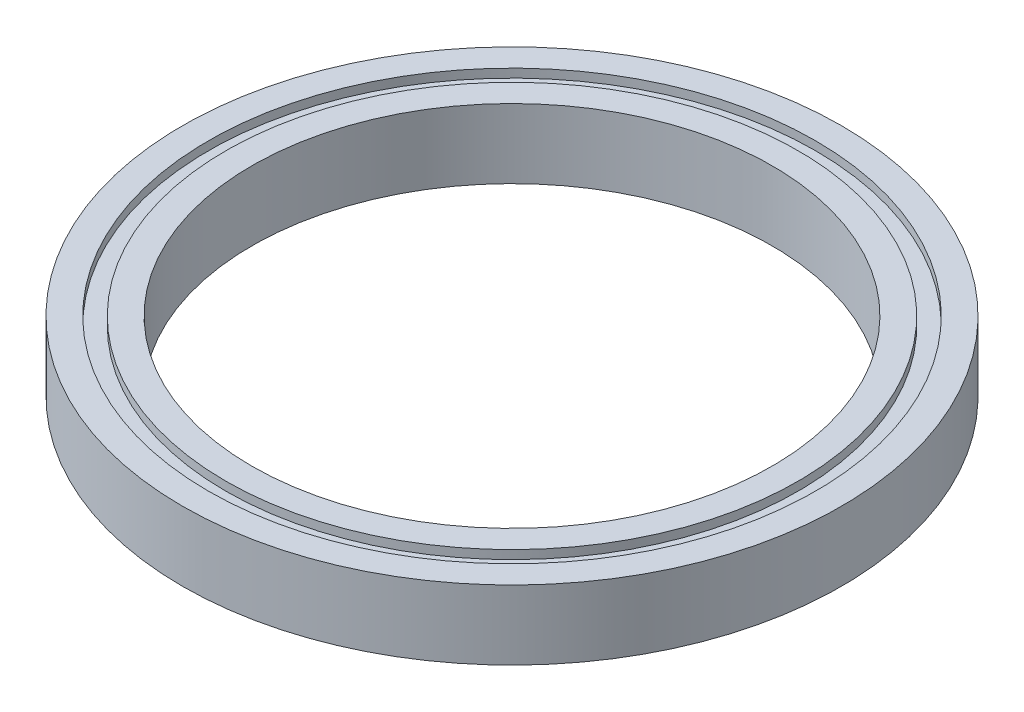
ISO-10303-21;
HEADER;
FILE_DESCRIPTION(('STEP AP214'),'2;1');
FILE_NAME('part.step','',(''),(''),'','','');
FILE_SCHEMA(('AUTOMOTIVE_DESIGN { 1 0 10303 214 1 1 1 1 }'));
ENDSEC;
DATA;
#1=APPLICATION_CONTEXT('core data for automotive mechanical design processes');
#2=APPLICATION_PROTOCOL_DEFINITION('international standard','automotive_design',2000,#1);
#3=PRODUCT_CONTEXT('',#1,'mechanical');
#4=PRODUCT('Part','Part','',(#3));
#5=PRODUCT_RELATED_PRODUCT_CATEGORY('part','',(#4));
#6=PRODUCT_DEFINITION_FORMATION('','',#4);
#7=PRODUCT_DEFINITION_CONTEXT('part definition',#1,'design');
#8=PRODUCT_DEFINITION('design','',#6,#7);
#9=PRODUCT_DEFINITION_SHAPE('','',#8);
#10=(LENGTH_UNIT() NAMED_UNIT(*) SI_UNIT(.MILLI.,.METRE.));
#11=(NAMED_UNIT(*) PLANE_ANGLE_UNIT() SI_UNIT($,.RADIAN.));
#12=(NAMED_UNIT(*) SI_UNIT($,.STERADIAN.) SOLID_ANGLE_UNIT());
#13=UNCERTAINTY_MEASURE_WITH_UNIT(LENGTH_MEASURE(1.E-05),#10,'distance_accuracy_value','');
#14=(GEOMETRIC_REPRESENTATION_CONTEXT(3) GLOBAL_UNCERTAINTY_ASSIGNED_CONTEXT((#13)) GLOBAL_UNIT_ASSIGNED_CONTEXT((#10,
#11,#12)) REPRESENTATION_CONTEXT('',''));
#15=CARTESIAN_POINT('',(0.,0.,0.));
#16=DIRECTION('',(0.,0.,1.));
#17=DIRECTION('',(1.,0.,0.));
#18=AXIS2_PLACEMENT_3D('',#15,#16,#17);
#19=CARTESIAN_POINT('',(0.,0.,0.));
#20=DIRECTION('',(0.,1.,0.));
#21=DIRECTION('',(0.,0.,1.));
#22=AXIS2_PLACEMENT_3D('',#19,#20,#21);
#23=PLANE('',#22);
#24=CARTESIAN_POINT('',(0.,0.,0.));
#25=DIRECTION('',(0.,1.,0.));
#26=DIRECTION('',(0.,0.,1.));
#27=AXIS2_PLACEMENT_3D('',#24,#25,#26);
#28=CIRCLE('',#27,30.);
#29=CARTESIAN_POINT('',(0.,0.,30.));
#30=VERTEX_POINT('',#29);
#31=EDGE_CURVE('E45',#30,#30,#28,.T.);
#32=ORIENTED_EDGE('',*,*,#31,.T.);
#33=EDGE_LOOP('',(#32));
#34=FACE_BOUND('',#33,.T.);
#35=CARTESIAN_POINT('',(0.,0.,0.));
#36=DIRECTION('',(0.,-1.,0.));
#37=DIRECTION('',(0.,0.,-1.));
#38=AXIS2_PLACEMENT_3D('',#35,#36,#37);
#39=CIRCLE('',#38,33.);
#40=CARTESIAN_POINT('',(0.,0.,-33.));
#41=VERTEX_POINT('',#40);
#42=EDGE_CURVE('E69',#41,#41,#39,.T.);
#43=ORIENTED_EDGE('',*,*,#42,.T.);
#44=EDGE_LOOP('',(#43));
#45=FACE_BOUND('',#44,.T.);
#46=ADVANCED_FACE('F32',(#34,#45),#23,.F.);
#47=CARTESIAN_POINT('',(0.,8.,0.));
#48=DIRECTION('',(0.,1.,0.));
#49=DIRECTION('',(0.,0.,1.));
#50=AXIS2_PLACEMENT_3D('',#47,#48,#49);
#51=PLANE('',#50);
#52=CARTESIAN_POINT('',(0.,8.,0.));
#53=DIRECTION('',(0.,1.,0.));
#54=DIRECTION('',(0.,0.,1.));
#55=AXIS2_PLACEMENT_3D('',#52,#53,#54);
#56=CIRCLE('',#55,30.);
#57=CARTESIAN_POINT('',(0.,8.,30.));
#58=VERTEX_POINT('',#57);
#59=EDGE_CURVE('E43',#58,#58,#56,.T.);
#60=ORIENTED_EDGE('',*,*,#59,.F.);
#61=EDGE_LOOP('',(#60));
#62=FACE_BOUND('',#61,.T.);
#63=CARTESIAN_POINT('',(0.,8.,0.));
#64=DIRECTION('',(0.,1.,0.));
#65=DIRECTION('',(0.,0.,1.));
#66=AXIS2_PLACEMENT_3D('',#63,#64,#65);
#67=CIRCLE('',#66,33.);
#68=CARTESIAN_POINT('',(0.,8.,33.));
#69=VERTEX_POINT('',#68);
#70=EDGE_CURVE('E57',#69,#69,#67,.T.);
#71=ORIENTED_EDGE('',*,*,#70,.T.);
#72=EDGE_LOOP('',(#71));
#73=FACE_BOUND('',#72,.T.);
#74=ADVANCED_FACE('F107',(#62,#73),#51,.T.);
#75=CARTESIAN_POINT('',(0.,8.,0.));
#76=DIRECTION('',(0.,1.,0.));
#77=DIRECTION('',(0.,0.,1.));
#78=AXIS2_PLACEMENT_3D('',#75,#76,#77);
#79=CIRCLE('',#78,35.);
#80=CARTESIAN_POINT('',(0.,8.,35.));
#81=VERTEX_POINT('',#80);
#82=EDGE_CURVE('E51',#81,#81,#79,.T.);
#83=ORIENTED_EDGE('',*,*,#82,.F.);
#84=EDGE_LOOP('',(#83));
#85=FACE_BOUND('',#84,.T.);
#86=CARTESIAN_POINT('',(0.,8.,0.));
#87=DIRECTION('',(0.,1.,0.));
#88=DIRECTION('',(0.,0.,1.));
#89=AXIS2_PLACEMENT_3D('',#86,#87,#88);
#90=CIRCLE('',#89,38.);
#91=CARTESIAN_POINT('',(0.,8.,38.));
#92=VERTEX_POINT('',#91);
#93=EDGE_CURVE('E10',#92,#92,#90,.T.);
#94=ORIENTED_EDGE('',*,*,#93,.T.);
#95=EDGE_LOOP('',(#94));
#96=FACE_BOUND('',#95,.T.);
#97=ADVANCED_FACE('F94',(#85,#96),#51,.T.);
#98=CARTESIAN_POINT('',(0.,0.,0.));
#99=DIRECTION('',(0.,-1.,0.));
#100=DIRECTION('',(0.,0.,-1.));
#101=AXIS2_PLACEMENT_3D('',#98,#99,#100);
#102=CIRCLE('',#101,35.);
#103=CARTESIAN_POINT('',(0.,0.,-35.));
#104=VERTEX_POINT('',#103);
#105=EDGE_CURVE('E63',#104,#104,#102,.T.);
#106=ORIENTED_EDGE('',*,*,#105,.F.);
#107=EDGE_LOOP('',(#106));
#108=FACE_BOUND('',#107,.T.);
#109=CARTESIAN_POINT('',(0.,0.,0.));
#110=DIRECTION('',(0.,1.,0.));
#111=DIRECTION('',(0.,0.,1.));
#112=AXIS2_PLACEMENT_3D('',#109,#110,#111);
#113=CIRCLE('',#112,38.);
#114=CARTESIAN_POINT('',(0.,0.,38.));
#115=VERTEX_POINT('',#114);
#116=EDGE_CURVE('E36',#115,#115,#113,.T.);
#117=ORIENTED_EDGE('',*,*,#116,.F.);
#118=EDGE_LOOP('',(#117));
#119=FACE_BOUND('',#118,.T.);
#120=ADVANCED_FACE('F91',(#108,#119),#23,.F.);
#121=CARTESIAN_POINT('',(0.,8.,0.));
#122=DIRECTION('',(0.,-1.,0.));
#123=DIRECTION('',(0.,0.,-1.));
#124=AXIS2_PLACEMENT_3D('',#121,#122,#123);
#125=CYLINDRICAL_SURFACE('',#124,38.);
#126=ORIENTED_EDGE('',*,*,#93,.F.);
#127=EDGE_LOOP('',(#126));
#128=FACE_BOUND('',#127,.T.);
#129=ORIENTED_EDGE('',*,*,#116,.T.);
#130=EDGE_LOOP('',(#129));
#131=FACE_BOUND('',#130,.T.);
#132=ADVANCED_FACE('F34',(#128,#131),#125,.T.);
#133=CARTESIAN_POINT('',(0.,8.,0.));
#134=DIRECTION('',(0.,-1.,0.));
#135=DIRECTION('',(0.,0.,-1.));
#136=AXIS2_PLACEMENT_3D('',#133,#134,#135);
#137=CYLINDRICAL_SURFACE('',#136,30.);
#138=ORIENTED_EDGE('',*,*,#59,.T.);
#139=EDGE_LOOP('',(#138));
#140=FACE_BOUND('',#139,.T.);
#141=ORIENTED_EDGE('',*,*,#31,.F.);
#142=EDGE_LOOP('',(#141));
#143=FACE_BOUND('',#142,.T.);
#144=ADVANCED_FACE('F98',(#140,#143),#137,.F.);
#145=CARTESIAN_POINT('',(0.,7.,0.));
#146=DIRECTION('',(0.,1.,0.));
#147=DIRECTION('',(0.,0.,1.));
#148=AXIS2_PLACEMENT_3D('',#145,#146,#147);
#149=CYLINDRICAL_SURFACE('',#148,35.);
#150=CARTESIAN_POINT('',(0.,7.,0.));
#151=DIRECTION('',(0.,1.,0.));
#152=DIRECTION('',(0.,0.,1.));
#153=AXIS2_PLACEMENT_3D('',#150,#151,#152);
#154=CIRCLE('',#153,35.);
#155=CARTESIAN_POINT('',(0.,7.,35.));
#156=VERTEX_POINT('',#155);
#157=EDGE_CURVE('E48',#156,#156,#154,.T.);
#158=ORIENTED_EDGE('',*,*,#157,.F.);
#159=EDGE_LOOP('',(#158));
#160=FACE_BOUND('',#159,.T.);
#161=ORIENTED_EDGE('',*,*,#82,.T.);
#162=EDGE_LOOP('',(#161));
#163=FACE_BOUND('',#162,.T.);
#164=ADVANCED_FACE('F103',(#160,#163),#149,.F.);
#165=CARTESIAN_POINT('',(0.,7.,0.));
#166=DIRECTION('',(0.,1.,0.));
#167=DIRECTION('',(0.,0.,1.));
#168=AXIS2_PLACEMENT_3D('',#165,#166,#167);
#169=PLANE('',#168);
#170=CARTESIAN_POINT('',(0.,7.,0.));
#171=DIRECTION('',(0.,1.,0.));
#172=DIRECTION('',(0.,0.,1.));
#173=AXIS2_PLACEMENT_3D('',#170,#171,#172);
#174=CIRCLE('',#173,33.);
#175=CARTESIAN_POINT('',(0.,7.,33.));
#176=VERTEX_POINT('',#175);
#177=EDGE_CURVE('E54',#176,#176,#174,.T.);
#178=ORIENTED_EDGE('',*,*,#177,.F.);
#179=EDGE_LOOP('',(#178));
#180=FACE_BOUND('',#179,.T.);
#181=ORIENTED_EDGE('',*,*,#157,.T.);
#182=EDGE_LOOP('',(#181));
#183=FACE_BOUND('',#182,.T.);
#184=ADVANCED_FACE('F120',(#180,#183),#169,.T.);
#185=CARTESIAN_POINT('',(0.,7.,0.));
#186=DIRECTION('',(0.,1.,0.));
#187=DIRECTION('',(0.,0.,1.));
#188=AXIS2_PLACEMENT_3D('',#185,#186,#187);
#189=CYLINDRICAL_SURFACE('',#188,33.);
#190=ORIENTED_EDGE('',*,*,#177,.T.);
#191=EDGE_LOOP('',(#190));
#192=FACE_BOUND('',#191,.T.);
#193=ORIENTED_EDGE('',*,*,#70,.F.);
#194=EDGE_LOOP('',(#193));
#195=FACE_BOUND('',#194,.T.);
#196=ADVANCED_FACE('F87',(#192,#195),#189,.T.);
#197=CARTESIAN_POINT('',(0.,1.,0.));
#198=DIRECTION('',(0.,-1.,0.));
#199=DIRECTION('',(0.,0.,-1.));
#200=AXIS2_PLACEMENT_3D('',#197,#198,#199);
#201=CYLINDRICAL_SURFACE('',#200,35.);
#202=CARTESIAN_POINT('',(0.,1.,0.));
#203=DIRECTION('',(0.,-1.,0.));
#204=DIRECTION('',(0.,0.,-1.));
#205=AXIS2_PLACEMENT_3D('',#202,#203,#204);
#206=CIRCLE('',#205,35.);
#207=CARTESIAN_POINT('',(0.,1.,-35.));
#208=VERTEX_POINT('',#207);
#209=EDGE_CURVE('E60',#208,#208,#206,.T.);
#210=ORIENTED_EDGE('',*,*,#209,.F.);
#211=EDGE_LOOP('',(#210));
#212=FACE_BOUND('',#211,.T.);
#213=ORIENTED_EDGE('',*,*,#105,.T.);
#214=EDGE_LOOP('',(#213));
#215=FACE_BOUND('',#214,.T.);
#216=ADVANCED_FACE('F81',(#212,#215),#201,.F.);
#217=CARTESIAN_POINT('',(0.,1.,0.));
#218=DIRECTION('',(0.,-1.,0.));
#219=DIRECTION('',(0.,0.,-1.));
#220=AXIS2_PLACEMENT_3D('',#217,#218,#219);
#221=PLANE('',#220);
#222=CARTESIAN_POINT('',(0.,1.,0.));
#223=DIRECTION('',(0.,-1.,0.));
#224=DIRECTION('',(0.,0.,-1.));
#225=AXIS2_PLACEMENT_3D('',#222,#223,#224);
#226=CIRCLE('',#225,33.);
#227=CARTESIAN_POINT('',(0.,1.,-33.));
#228=VERTEX_POINT('',#227);
#229=EDGE_CURVE('E66',#228,#228,#226,.T.);
#230=ORIENTED_EDGE('',*,*,#229,.F.);
#231=EDGE_LOOP('',(#230));
#232=FACE_BOUND('',#231,.T.);
#233=ORIENTED_EDGE('',*,*,#209,.T.);
#234=EDGE_LOOP('',(#233));
#235=FACE_BOUND('',#234,.T.);
#236=ADVANCED_FACE('F78',(#232,#235),#221,.T.);
#237=CARTESIAN_POINT('',(0.,1.,0.));
#238=DIRECTION('',(0.,-1.,0.));
#239=DIRECTION('',(0.,0.,-1.));
#240=AXIS2_PLACEMENT_3D('',#237,#238,#239);
#241=CYLINDRICAL_SURFACE('',#240,33.);
#242=ORIENTED_EDGE('',*,*,#229,.T.);
#243=EDGE_LOOP('',(#242));
#244=FACE_BOUND('',#243,.T.);
#245=ORIENTED_EDGE('',*,*,#42,.F.);
#246=EDGE_LOOP('',(#245));
#247=FACE_BOUND('',#246,.T.);
#248=ADVANCED_FACE('F75',(#244,#247),#241,.T.);
#249=CLOSED_SHELL('',(#46,#74,#97,#120,#132,#144,#164,#184,#196,#216,#236,#248));
#250=MANIFOLD_SOLID_BREP('B2',#249);
#251=ADVANCED_BREP_SHAPE_REPRESENTATION('',(#18,#250),#14);
#252=SHAPE_DEFINITION_REPRESENTATION(#9,#251);
ENDSEC;
END-ISO-10303-21;
